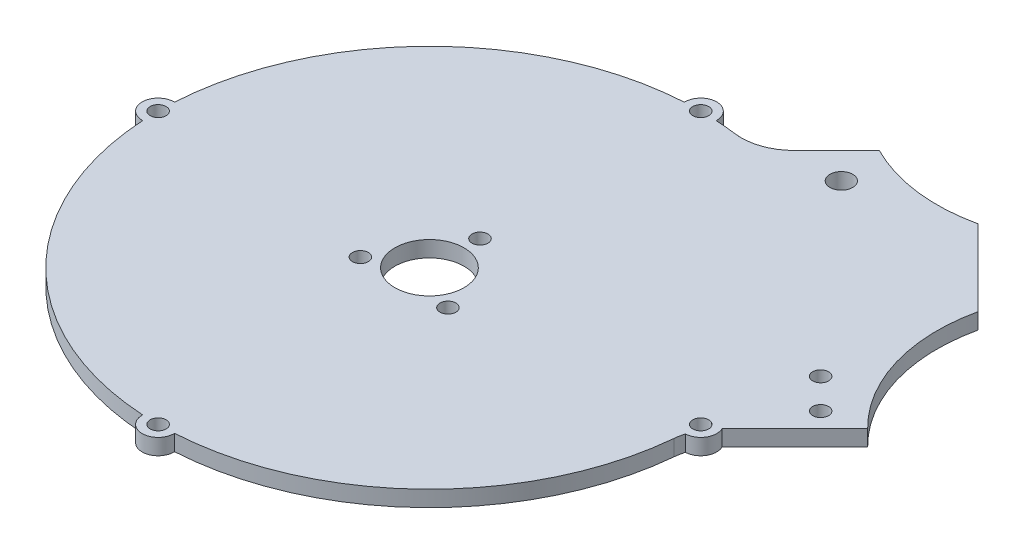
ISO-10303-21;
HEADER;
FILE_DESCRIPTION(('STEP AP214'),'2;1');
FILE_NAME('part.step','',(''),(''),'','','');
FILE_SCHEMA(('AUTOMOTIVE_DESIGN { 1 0 10303 214 1 1 1 1 }'));
ENDSEC;
DATA;
#1=APPLICATION_CONTEXT('core data for automotive mechanical design processes');
#2=APPLICATION_PROTOCOL_DEFINITION('international standard','automotive_design',2000,#1);
#3=PRODUCT_CONTEXT('',#1,'mechanical');
#4=PRODUCT('Part','Part','',(#3));
#5=PRODUCT_RELATED_PRODUCT_CATEGORY('part','',(#4));
#6=PRODUCT_DEFINITION_FORMATION('','',#4);
#7=PRODUCT_DEFINITION_CONTEXT('part definition',#1,'design');
#8=PRODUCT_DEFINITION('design','',#6,#7);
#9=PRODUCT_DEFINITION_SHAPE('','',#8);
#10=(LENGTH_UNIT() NAMED_UNIT(*) SI_UNIT(.MILLI.,.METRE.));
#11=(NAMED_UNIT(*) PLANE_ANGLE_UNIT() SI_UNIT($,.RADIAN.));
#12=(NAMED_UNIT(*) SI_UNIT($,.STERADIAN.) SOLID_ANGLE_UNIT());
#13=UNCERTAINTY_MEASURE_WITH_UNIT(LENGTH_MEASURE(1.E-05),#10,'distance_accuracy_value','');
#14=(GEOMETRIC_REPRESENTATION_CONTEXT(3) GLOBAL_UNCERTAINTY_ASSIGNED_CONTEXT((#13)) GLOBAL_UNIT_ASSIGNED_CONTEXT((#10,
#11,#12)) REPRESENTATION_CONTEXT('',''));
#15=CARTESIAN_POINT('',(0.,0.,0.));
#16=DIRECTION('',(0.,0.,1.));
#17=DIRECTION('',(1.,0.,0.));
#18=AXIS2_PLACEMENT_3D('',#15,#16,#17);
#19=CARTESIAN_POINT('',(0.,0.,0.));
#20=DIRECTION('',(0.,1.,0.));
#21=DIRECTION('',(0.,0.,1.));
#22=AXIS2_PLACEMENT_3D('',#19,#20,#21);
#23=CYLINDRICAL_SURFACE('',#22,51.);
#24=DIRECTION('',(0.,1.,0.));
#25=VECTOR('',#24,1.);
#26=CARTESIAN_POINT('',(2.99870214140638,1.5,50.9117647058823));
#27=LINE('',#26,#25);
#28=CARTESIAN_POINT('',(2.99870214140638,0.,50.9117647058823));
#29=VERTEX_POINT('',#28);
#30=CARTESIAN_POINT('',(2.99870214140638,3.,50.9117647058823));
#31=VERTEX_POINT('',#30);
#32=EDGE_CURVE('E147',#29,#31,#27,.T.);
#33=ORIENTED_EDGE('',*,*,#32,.F.);
#34=CARTESIAN_POINT('',(0.,0.,0.));
#35=DIRECTION('',(0.,1.,0.));
#36=DIRECTION('',(0.,0.,1.));
#37=AXIS2_PLACEMENT_3D('',#34,#35,#36);
#38=CIRCLE('',#37,51.);
#39=CARTESIAN_POINT('',(50.7738215927974,0.,4.79781625979776));
#40=VERTEX_POINT('',#39);
#41=EDGE_CURVE('E160',#29,#40,#38,.T.);
#42=ORIENTED_EDGE('',*,*,#41,.T.);
#43=DIRECTION('',(0.,1.,0.));
#44=VECTOR('',#43,1.);
#45=CARTESIAN_POINT('',(50.7738215927974,0.,4.79781625979776));
#46=LINE('',#45,#44);
#47=CARTESIAN_POINT('',(50.7738215927974,3.,4.79781625979776));
#48=VERTEX_POINT('',#47);
#49=EDGE_CURVE('E179',#40,#48,#46,.T.);
#50=ORIENTED_EDGE('',*,*,#49,.T.);
#51=CARTESIAN_POINT('',(0.,3.,0.));
#52=DIRECTION('',(0.,1.,0.));
#53=DIRECTION('',(0.,0.,1.));
#54=AXIS2_PLACEMENT_3D('',#51,#52,#53);
#55=CIRCLE('',#54,51.);
#56=EDGE_CURVE('E161',#31,#48,#55,.T.);
#57=ORIENTED_EDGE('',*,*,#56,.F.);
#58=EDGE_LOOP('',(#33,#42,#50,#57));
#59=FACE_BOUND('',#58,.T.);
#60=ADVANCED_FACE('F39',(#59),#23,.T.);
#61=DIRECTION('',(0.,1.,0.));
#62=VECTOR('',#61,1.);
#63=CARTESIAN_POINT('',(-2.99870214140531,1.5,50.9117647058824));
#64=LINE('',#63,#62);
#65=CARTESIAN_POINT('',(-2.99870214140531,3.,50.9117647058824));
#66=VERTEX_POINT('',#65);
#67=CARTESIAN_POINT('',(-2.99870214140531,0.,50.9117647058824));
#68=VERTEX_POINT('',#67);
#69=EDGE_CURVE('E150',#66,#68,#64,.F.);
#70=ORIENTED_EDGE('',*,*,#69,.F.);
#71=CARTESIAN_POINT('',(-50.9117647058824,3.,2.99870214140584));
#72=VERTEX_POINT('',#71);
#73=EDGE_CURVE('E479',#72,#66,#55,.T.);
#74=ORIENTED_EDGE('',*,*,#73,.F.);
#75=DIRECTION('',(0.,1.,0.));
#76=VECTOR('',#75,1.);
#77=CARTESIAN_POINT('',(-50.9117647058824,1.5,2.99870214140584));
#78=LINE('',#77,#76);
#79=CARTESIAN_POINT('',(-50.9117647058824,0.,2.99870214140584));
#80=VERTEX_POINT('',#79);
#81=EDGE_CURVE('E197',#80,#72,#78,.T.);
#82=ORIENTED_EDGE('',*,*,#81,.F.);
#83=EDGE_CURVE('E166',#80,#68,#38,.T.);
#84=ORIENTED_EDGE('',*,*,#83,.T.);
#85=EDGE_LOOP('',(#70,#74,#82,#84));
#86=FACE_BOUND('',#85,.T.);
#87=ADVANCED_FACE('F370',(#86),#23,.T.);
#88=DIRECTION('',(0.,1.,0.));
#89=VECTOR('',#88,1.);
#90=CARTESIAN_POINT('',(-50.9117647058824,1.5,-2.99870214140584));
#91=LINE('',#90,#89);
#92=CARTESIAN_POINT('',(-50.9117647058824,3.,-2.99870214140584));
#93=VERTEX_POINT('',#92);
#94=CARTESIAN_POINT('',(-50.9117647058824,0.,-2.99870214140584));
#95=VERTEX_POINT('',#94);
#96=EDGE_CURVE('E187',#93,#95,#91,.F.);
#97=ORIENTED_EDGE('',*,*,#96,.F.);
#98=CARTESIAN_POINT('',(-2.99870214140602,3.,-50.9117647058824));
#99=VERTEX_POINT('',#98);
#100=EDGE_CURVE('E291',#99,#93,#55,.T.);
#101=ORIENTED_EDGE('',*,*,#100,.F.);
#102=DIRECTION('',(0.,1.,0.));
#103=VECTOR('',#102,1.);
#104=CARTESIAN_POINT('',(-2.99870214140602,1.5,-50.9117647058824));
#105=LINE('',#104,#103);
#106=CARTESIAN_POINT('',(-2.99870214140602,0.,-50.9117647058824));
#107=VERTEX_POINT('',#106);
#108=EDGE_CURVE('E11',#107,#99,#105,.T.);
#109=ORIENTED_EDGE('',*,*,#108,.F.);
#110=EDGE_CURVE('E170',#107,#95,#38,.T.);
#111=ORIENTED_EDGE('',*,*,#110,.T.);
#112=EDGE_LOOP('',(#97,#101,#109,#111));
#113=FACE_BOUND('',#112,.T.);
#114=ADVANCED_FACE('F185',(#113),#23,.T.);
#115=CARTESIAN_POINT('',(60.7294728855028,0.,5.73856454603262));
#116=DIRECTION('',(0.,1.,0.));
#117=DIRECTION('',(0.,0.,1.));
#118=AXIS2_PLACEMENT_3D('',#115,#116,#117);
#119=CYLINDRICAL_SURFACE('',#118,10.);
#120=CARTESIAN_POINT('',(60.7294728855028,0.,5.73856454603262));
#121=DIRECTION('',(0.,1.,0.));
#122=DIRECTION('',(0.,0.,1.));
#123=AXIS2_PLACEMENT_3D('',#120,#121,#122);
#124=CIRCLE('',#123,10.);
#125=CARTESIAN_POINT('',(51.1123667835304,0.,2.99789487907082));
#126=VERTEX_POINT('',#125);
#127=EDGE_CURVE('E59',#126,#40,#124,.T.);
#128=ORIENTED_EDGE('',*,*,#127,.F.);
#129=DIRECTION('',(0.,1.,0.));
#130=VECTOR('',#129,1.);
#131=CARTESIAN_POINT('',(51.1123667835304,1.5,2.99789487907082));
#132=LINE('',#131,#130);
#133=CARTESIAN_POINT('',(51.1123667835304,3.,2.99789487907082));
#134=VERTEX_POINT('',#133);
#135=EDGE_CURVE('E54',#126,#134,#132,.T.);
#136=ORIENTED_EDGE('',*,*,#135,.T.);
#137=CARTESIAN_POINT('',(60.7294728855028,3.,5.73856454603262));
#138=DIRECTION('',(0.,1.,0.));
#139=DIRECTION('',(0.,0.,1.));
#140=AXIS2_PLACEMENT_3D('',#137,#138,#139);
#141=CIRCLE('',#140,10.);
#142=EDGE_CURVE('E231',#48,#134,#141,.F.);
#143=ORIENTED_EDGE('',*,*,#142,.F.);
#144=ORIENTED_EDGE('',*,*,#49,.F.);
#145=EDGE_LOOP('',(#128,#136,#143,#144));
#146=FACE_BOUND('',#145,.T.);
#147=ADVANCED_FACE('F387',(#146),#119,.F.);
#148=CARTESIAN_POINT('',(61.5182899632296,0.,-13.4350288425444));
#149=DIRECTION('',(0.,1.,0.));
#150=DIRECTION('',(0.,0.,1.));
#151=AXIS2_PLACEMENT_3D('',#148,#149,#150);
#152=PLANE('',#151);
#153=CARTESIAN_POINT('',(5.34196644842999E-13,0.,51.));
#154=DIRECTION('',(0.,1.,0.));
#155=DIRECTION('',(-1.,0.,0.));
#156=AXIS2_PLACEMENT_3D('',#153,#154,#155);
#157=CIRCLE('',#156,1.5);
#158=CARTESIAN_POINT('',(-1.49999999999947,0.,51.));
#159=VERTEX_POINT('',#158);
#160=EDGE_CURVE('E469',#159,#159,#157,.T.);
#161=ORIENTED_EDGE('',*,*,#160,.T.);
#162=EDGE_LOOP('',(#161));
#163=FACE_BOUND('',#162,.T.);
#164=ORIENTED_EDGE('',*,*,#41,.F.);
#165=CARTESIAN_POINT('',(5.34196644842999E-13,0.,51.));
#166=DIRECTION('',(0.,1.,0.));
#167=DIRECTION('',(-1.,0.,0.));
#168=AXIS2_PLACEMENT_3D('',#165,#166,#167);
#169=CIRCLE('',#168,3.);
#170=EDGE_CURVE('E144',#68,#29,#169,.T.);
#171=ORIENTED_EDGE('',*,*,#170,.F.);
#172=ORIENTED_EDGE('',*,*,#83,.F.);
#173=CARTESIAN_POINT('',(-51.,0.,0.));
#174=DIRECTION('',(0.,1.,0.));
#175=DIRECTION('',(0.,0.,-1.));
#176=AXIS2_PLACEMENT_3D('',#173,#174,#175);
#177=CIRCLE('',#176,3.);
#178=EDGE_CURVE('E192',#95,#80,#177,.T.);
#179=ORIENTED_EDGE('',*,*,#178,.F.);
#180=ORIENTED_EDGE('',*,*,#110,.F.);
#181=CARTESIAN_POINT('',(-1.78065548281E-13,0.,-51.));
#182=DIRECTION('',(0.,1.,0.));
#183=DIRECTION('',(1.,0.,0.));
#184=AXIS2_PLACEMENT_3D('',#181,#182,#183);
#185=CIRCLE('',#184,3.);
#186=CARTESIAN_POINT('',(2.99870214140566,0.,-50.9117647058824));
#187=VERTEX_POINT('',#186);
#188=EDGE_CURVE('E191',#187,#107,#185,.T.);
#189=ORIENTED_EDGE('',*,*,#188,.F.);
#190=CARTESIAN_POINT('',(6.79713410242907,0.,-50.5450192204296));
#191=VERTEX_POINT('',#190);
#192=EDGE_CURVE('E169',#191,#187,#38,.T.);
#193=ORIENTED_EDGE('',*,*,#192,.F.);
#194=CARTESIAN_POINT('',(8.12990549506221,0.,-60.4558073028668));
#195=DIRECTION('',(0.,1.,0.));
#196=DIRECTION('',(0.,0.,1.));
#197=AXIS2_PLACEMENT_3D('',#194,#195,#196);
#198=CIRCLE('',#197,10.);
#199=CARTESIAN_POINT('',(15.2009733069277,0.,-53.3847394910013));
#200=VERTEX_POINT('',#199);
#201=EDGE_CURVE('E172',#191,#200,#198,.T.);
#202=ORIENTED_EDGE('',*,*,#201,.T.);
#203=DIRECTION('',(-0.707106781186549,0.,0.707106781186546));
#204=VECTOR('',#203,1.);
#205=CARTESIAN_POINT('',(28.2842712474619,0.,-66.4680374315354));
#206=LINE('',#205,#204);
#207=CARTESIAN_POINT('',(23.1909186497913,0.,-61.3746848338648));
#208=VERTEX_POINT('',#207);
#209=EDGE_CURVE('E253',#208,#200,#206,.T.);
#210=ORIENTED_EDGE('',*,*,#209,.F.);
#211=CARTESIAN_POINT('',(37.4766594028945,0.,-89.4490078201218));
#212=DIRECTION('',(0.,1.,0.));
#213=DIRECTION('',(0.,0.,1.));
#214=AXIS2_PLACEMENT_3D('',#211,#212,#213);
#215=CIRCLE('',#214,31.5000000000246);
#216=CARTESIAN_POINT('',(44.4009767321595,0.,-58.7194808220505));
#217=VERTEX_POINT('',#216);
#218=EDGE_CURVE('E257',#208,#217,#215,.T.);
#219=ORIENTED_EDGE('',*,*,#218,.T.);
#220=DIRECTION('',(0.707106781186569,0.,0.707106781186526));
#221=VECTOR('',#220,1.);
#222=CARTESIAN_POINT('',(58.7194808220593,0.,-44.4009767321515));
#223=LINE('',#222,#221);
#224=CARTESIAN_POINT('',(58.7194808220593,0.,-44.4009767321515));
#225=VERTEX_POINT('',#224);
#226=EDGE_CURVE('E227',#217,#225,#223,.T.);
#227=ORIENTED_EDGE('',*,*,#226,.T.);
#228=CARTESIAN_POINT('',(89.4490078201045,0.,-37.4766594028825));
#229=DIRECTION('',(0.,1.,0.));
#230=DIRECTION('',(0.,0.,1.));
#231=AXIS2_PLACEMENT_3D('',#228,#229,#230);
#232=CIRCLE('',#231,31.5);
#233=CARTESIAN_POINT('',(67.3526224138888,0.,-15.0267206060844));
#234=VERTEX_POINT('',#233);
#235=EDGE_CURVE('E245',#225,#234,#232,.T.);
#236=ORIENTED_EDGE('',*,*,#235,.T.);
#237=DIRECTION('',(0.707106781186547,0.,-0.707106781186548));
#238=VECTOR('',#237,1.);
#239=CARTESIAN_POINT('',(63.6396103067892,0.,-11.3137084989848));
#240=LINE('',#239,#238);
#241=CARTESIAN_POINT('',(53.6780181730065,0.,-1.352116365202));
#242=VERTEX_POINT('',#241);
#243=EDGE_CURVE('E249',#242,#234,#240,.T.);
#244=ORIENTED_EDGE('',*,*,#243,.F.);
#245=CARTESIAN_POINT('',(51.,0.,0.));
#246=DIRECTION('',(0.,1.,0.));
#247=DIRECTION('',(0.,0.,1.));
#248=AXIS2_PLACEMENT_3D('',#245,#246,#247);
#249=CIRCLE('',#248,3.);
#250=EDGE_CURVE('E223',#126,#242,#249,.T.);
#251=ORIENTED_EDGE('',*,*,#250,.F.);
#252=ORIENTED_EDGE('',*,*,#127,.T.);
#253=EDGE_LOOP('',(#164,#171,#172,#179,#180,#189,#193,#202,#210,#219,#227,#236,#244,#251,#252));
#254=FACE_BOUND('',#253,.T.);
#255=CARTESIAN_POINT('',(0.,0.,0.));
#256=DIRECTION('',(0.,1.,0.));
#257=DIRECTION('',(0.,0.,1.));
#258=AXIS2_PLACEMENT_3D('',#255,#256,#257);
#259=CIRCLE('',#258,6.5);
#260=CARTESIAN_POINT('',(0.,0.,6.5));
#261=VERTEX_POINT('',#260);
#262=EDGE_CURVE('E240',#261,#261,#259,.T.);
#263=ORIENTED_EDGE('',*,*,#262,.T.);
#264=EDGE_LOOP('',(#263));
#265=FACE_BOUND('',#264,.T.);
#266=CARTESIAN_POINT('',(0.,0.,-9.5));
#267=DIRECTION('',(0.,1.,0.));
#268=DIRECTION('',(0.,0.,1.));
#269=AXIS2_PLACEMENT_3D('',#266,#267,#268);
#270=CIRCLE('',#269,1.5);
#271=CARTESIAN_POINT('',(0.,0.,-8.));
#272=VERTEX_POINT('',#271);
#273=EDGE_CURVE('E296',#272,#272,#270,.T.);
#274=ORIENTED_EDGE('',*,*,#273,.T.);
#275=EDGE_LOOP('',(#274));
#276=FACE_BOUND('',#275,.T.);
#277=CARTESIAN_POINT('',(8.22724133595277,0.,4.74999999999965));
#278=DIRECTION('',(0.,1.,0.));
#279=DIRECTION('',(0.,0.,1.));
#280=AXIS2_PLACEMENT_3D('',#277,#278,#279);
#281=CIRCLE('',#280,1.50000000000052);
#282=CARTESIAN_POINT('',(8.22724133595277,0.,6.25000000000017));
#283=VERTEX_POINT('',#282);
#284=EDGE_CURVE('E299',#283,#283,#281,.T.);
#285=ORIENTED_EDGE('',*,*,#284,.T.);
#286=EDGE_LOOP('',(#285));
#287=FACE_BOUND('',#286,.T.);
#288=CARTESIAN_POINT('',(-8.22724133595156,0.,4.75000000000035));
#289=DIRECTION('',(0.,1.,0.));
#290=DIRECTION('',(0.,0.,1.));
#291=AXIS2_PLACEMENT_3D('',#288,#289,#290);
#292=CIRCLE('',#291,1.50000000000077);
#293=CARTESIAN_POINT('',(-8.22724133595156,0.,6.25000000000112));
#294=VERTEX_POINT('',#293);
#295=EDGE_CURVE('E302',#294,#294,#292,.T.);
#296=ORIENTED_EDGE('',*,*,#295,.T.);
#297=EDGE_LOOP('',(#296));
#298=FACE_BOUND('',#297,.T.);
#299=CARTESIAN_POINT('',(54.4472221513641,0.,-19.0918830920368));
#300=DIRECTION('',(0.,1.,0.));
#301=DIRECTION('',(0.,0.,1.));
#302=AXIS2_PLACEMENT_3D('',#299,#300,#301);
#303=CIRCLE('',#302,1.50000000000001);
#304=CARTESIAN_POINT('',(54.4472221513641,0.,-17.5918830920368));
#305=VERTEX_POINT('',#304);
#306=EDGE_CURVE('E305',#305,#305,#303,.T.);
#307=ORIENTED_EDGE('',*,*,#306,.T.);
#308=EDGE_LOOP('',(#307));
#309=FACE_BOUND('',#308,.T.);
#310=CARTESIAN_POINT('',(60.1040764008567,0.,-13.4350288425445));
#311=DIRECTION('',(0.,1.,0.));
#312=DIRECTION('',(0.,0.,1.));
#313=AXIS2_PLACEMENT_3D('',#310,#311,#312);
#314=CIRCLE('',#313,1.5);
#315=CARTESIAN_POINT('',(60.1040764008567,0.,-11.9350288425446));
#316=VERTEX_POINT('',#315);
#317=EDGE_CURVE('E308',#316,#316,#314,.T.);
#318=ORIENTED_EDGE('',*,*,#317,.T.);
#319=EDGE_LOOP('',(#318));
#320=FACE_BOUND('',#319,.T.);
#321=CARTESIAN_POINT('',(24.5719606462309,0.,-52.8562318936951));
#322=DIRECTION('',(0.,1.,0.));
#323=DIRECTION('',(0.,0.,1.));
#324=AXIS2_PLACEMENT_3D('',#321,#322,#323);
#325=CIRCLE('',#324,2.15);
#326=CARTESIAN_POINT('',(24.5719606462309,0.,-50.7062318936951));
#327=VERTEX_POINT('',#326);
#328=EDGE_CURVE('E248',#327,#327,#325,.T.);
#329=ORIENTED_EDGE('',*,*,#328,.T.);
#330=EDGE_LOOP('',(#329));
#331=FACE_BOUND('',#330,.T.);
#332=CARTESIAN_POINT('',(-51.,0.,0.));
#333=DIRECTION('',(0.,1.,0.));
#334=DIRECTION('',(0.,0.,-1.));
#335=AXIS2_PLACEMENT_3D('',#332,#333,#334);
#336=CIRCLE('',#335,1.5);
#337=CARTESIAN_POINT('',(-51.,0.,-1.5));
#338=VERTEX_POINT('',#337);
#339=EDGE_CURVE('E200',#338,#338,#336,.T.);
#340=ORIENTED_EDGE('',*,*,#339,.T.);
#341=EDGE_LOOP('',(#340));
#342=FACE_BOUND('',#341,.T.);
#343=CARTESIAN_POINT('',(51.,0.,0.));
#344=DIRECTION('',(0.,1.,0.));
#345=DIRECTION('',(0.,0.,1.));
#346=AXIS2_PLACEMENT_3D('',#343,#344,#345);
#347=CIRCLE('',#346,1.5);
#348=CARTESIAN_POINT('',(51.,0.,1.5));
#349=VERTEX_POINT('',#348);
#350=EDGE_CURVE('E217',#349,#349,#347,.T.);
#351=ORIENTED_EDGE('',*,*,#350,.T.);
#352=EDGE_LOOP('',(#351));
#353=FACE_BOUND('',#352,.T.);
#354=CARTESIAN_POINT('',(-1.78065548281E-13,0.,-51.));
#355=DIRECTION('',(0.,1.,0.));
#356=DIRECTION('',(1.,0.,0.));
#357=AXIS2_PLACEMENT_3D('',#354,#355,#356);
#358=CIRCLE('',#357,1.5);
#359=CARTESIAN_POINT('',(1.49999999999983,0.,-51.));
#360=VERTEX_POINT('',#359);
#361=EDGE_CURVE('E207',#360,#360,#358,.T.);
#362=ORIENTED_EDGE('',*,*,#361,.T.);
#363=EDGE_LOOP('',(#362));
#364=FACE_BOUND('',#363,.T.);
#365=ADVANCED_FACE('F41',(#163,#254,#265,#276,#287,#298,#309,#320,#331,#342,#353,#364),#152,.F.);
#366=CARTESIAN_POINT('',(61.5182899632296,3.,-13.4350288425444));
#367=DIRECTION('',(0.,1.,0.));
#368=DIRECTION('',(0.,0.,1.));
#369=AXIS2_PLACEMENT_3D('',#366,#367,#368);
#370=PLANE('',#369);
#371=CARTESIAN_POINT('',(-1.78065548281E-13,3.,-51.));
#372=DIRECTION('',(0.,1.,0.));
#373=DIRECTION('',(1.,0.,0.));
#374=AXIS2_PLACEMENT_3D('',#371,#372,#373);
#375=CIRCLE('',#374,1.5);
#376=CARTESIAN_POINT('',(1.49999999999983,3.,-51.));
#377=VERTEX_POINT('',#376);
#378=EDGE_CURVE('E206',#377,#377,#375,.T.);
#379=ORIENTED_EDGE('',*,*,#378,.F.);
#380=EDGE_LOOP('',(#379));
#381=FACE_BOUND('',#380,.T.);
#382=CARTESIAN_POINT('',(-51.,3.,0.));
#383=DIRECTION('',(0.,1.,0.));
#384=DIRECTION('',(0.,0.,-1.));
#385=AXIS2_PLACEMENT_3D('',#382,#383,#384);
#386=CIRCLE('',#385,1.5);
#387=CARTESIAN_POINT('',(-51.,3.,-1.5));
#388=VERTEX_POINT('',#387);
#389=EDGE_CURVE('E162',#388,#388,#386,.T.);
#390=ORIENTED_EDGE('',*,*,#389,.F.);
#391=EDGE_LOOP('',(#390));
#392=FACE_BOUND('',#391,.T.);
#393=CARTESIAN_POINT('',(5.34196644842999E-13,3.,51.));
#394=DIRECTION('',(0.,1.,0.));
#395=DIRECTION('',(-1.,0.,0.));
#396=AXIS2_PLACEMENT_3D('',#393,#394,#395);
#397=CIRCLE('',#396,1.5);
#398=CARTESIAN_POINT('',(-1.49999999999947,3.,51.));
#399=VERTEX_POINT('',#398);
#400=EDGE_CURVE('E438',#399,#399,#397,.T.);
#401=ORIENTED_EDGE('',*,*,#400,.F.);
#402=EDGE_LOOP('',(#401));
#403=FACE_BOUND('',#402,.T.);
#404=CARTESIAN_POINT('',(51.,3.,0.));
#405=DIRECTION('',(0.,1.,0.));
#406=DIRECTION('',(0.,0.,1.));
#407=AXIS2_PLACEMENT_3D('',#404,#405,#406);
#408=CIRCLE('',#407,1.5);
#409=CARTESIAN_POINT('',(51.,3.,1.5));
#410=VERTEX_POINT('',#409);
#411=EDGE_CURVE('E214',#410,#410,#408,.T.);
#412=ORIENTED_EDGE('',*,*,#411,.F.);
#413=EDGE_LOOP('',(#412));
#414=FACE_BOUND('',#413,.T.);
#415=ORIENTED_EDGE('',*,*,#73,.T.);
#416=CARTESIAN_POINT('',(5.34196644842999E-13,3.,51.));
#417=DIRECTION('',(0.,1.,0.));
#418=DIRECTION('',(-1.,0.,0.));
#419=AXIS2_PLACEMENT_3D('',#416,#417,#418);
#420=CIRCLE('',#419,3.);
#421=EDGE_CURVE('E155',#66,#31,#420,.T.);
#422=ORIENTED_EDGE('',*,*,#421,.T.);
#423=ORIENTED_EDGE('',*,*,#56,.T.);
#424=ORIENTED_EDGE('',*,*,#142,.T.);
#425=CARTESIAN_POINT('',(51.,3.,0.));
#426=DIRECTION('',(0.,1.,0.));
#427=DIRECTION('',(0.,0.,1.));
#428=AXIS2_PLACEMENT_3D('',#425,#426,#427);
#429=CIRCLE('',#428,3.);
#430=CARTESIAN_POINT('',(53.6780181730065,3.,-1.352116365202));
#431=VERTEX_POINT('',#430);
#432=EDGE_CURVE('E220',#134,#431,#429,.T.);
#433=ORIENTED_EDGE('',*,*,#432,.T.);
#434=DIRECTION('',(0.707106781186547,0.,-0.707106781186548));
#435=VECTOR('',#434,1.);
#436=CARTESIAN_POINT('',(53.6584050736373,3.,-1.33250326583285));
#437=LINE('',#436,#435);
#438=CARTESIAN_POINT('',(67.3526224138888,3.,-15.0267206060844));
#439=VERTEX_POINT('',#438);
#440=EDGE_CURVE('E228',#431,#439,#437,.T.);
#441=ORIENTED_EDGE('',*,*,#440,.T.);
#442=CARTESIAN_POINT('',(89.4490078201045,3.,-37.4766594028825));
#443=DIRECTION('',(0.,1.,0.));
#444=DIRECTION('',(0.,0.,1.));
#445=AXIS2_PLACEMENT_3D('',#442,#443,#444);
#446=CIRCLE('',#445,31.5);
#447=CARTESIAN_POINT('',(58.7194808220593,3.,-44.4009767321515));
#448=VERTEX_POINT('',#447);
#449=EDGE_CURVE('E230',#439,#448,#446,.F.);
#450=ORIENTED_EDGE('',*,*,#449,.T.);
#451=DIRECTION('',(-0.707106781186569,0.,-0.707106781186526));
#452=VECTOR('',#451,1.);
#453=CARTESIAN_POINT('',(58.7194808220593,3.,-44.4009767321515));
#454=LINE('',#453,#452);
#455=CARTESIAN_POINT('',(44.4009767321595,3.,-58.7194808220505));
#456=VERTEX_POINT('',#455);
#457=EDGE_CURVE('E237',#448,#456,#454,.T.);
#458=ORIENTED_EDGE('',*,*,#457,.T.);
#459=CARTESIAN_POINT('',(37.4766594028945,3.,-89.4490078201218));
#460=DIRECTION('',(0.,1.,0.));
#461=DIRECTION('',(0.,0.,1.));
#462=AXIS2_PLACEMENT_3D('',#459,#460,#461);
#463=CIRCLE('',#462,31.5000000000246);
#464=CARTESIAN_POINT('',(23.1909186497913,3.,-61.3746848338648));
#465=VERTEX_POINT('',#464);
#466=EDGE_CURVE('E236',#456,#465,#463,.F.);
#467=ORIENTED_EDGE('',*,*,#466,.T.);
#468=DIRECTION('',(-0.707106781186548,0.,0.707106781186547));
#469=VECTOR('',#468,1.);
#470=CARTESIAN_POINT('',(23.1909186497913,3.,-61.3746848338648));
#471=LINE('',#470,#469);
#472=CARTESIAN_POINT('',(15.2009733069277,3.,-53.3847394910013));
#473=VERTEX_POINT('',#472);
#474=EDGE_CURVE('E232',#465,#473,#471,.T.);
#475=ORIENTED_EDGE('',*,*,#474,.T.);
#476=CARTESIAN_POINT('',(8.12990549506221,3.,-60.4558073028668));
#477=DIRECTION('',(0.,1.,0.));
#478=DIRECTION('',(0.,0.,1.));
#479=AXIS2_PLACEMENT_3D('',#476,#477,#478);
#480=CIRCLE('',#479,10.);
#481=CARTESIAN_POINT('',(6.79713410242907,3.,-50.5450192204296));
#482=VERTEX_POINT('',#481);
#483=EDGE_CURVE('E235',#473,#482,#480,.F.);
#484=ORIENTED_EDGE('',*,*,#483,.T.);
#485=CARTESIAN_POINT('',(2.99870214140566,3.,-50.9117647058824));
#486=VERTEX_POINT('',#485);
#487=EDGE_CURVE('E288',#482,#486,#55,.T.);
#488=ORIENTED_EDGE('',*,*,#487,.T.);
#489=CARTESIAN_POINT('',(-1.78065548281E-13,3.,-51.));
#490=DIRECTION('',(0.,1.,0.));
#491=DIRECTION('',(1.,0.,0.));
#492=AXIS2_PLACEMENT_3D('',#489,#490,#491);
#493=CIRCLE('',#492,3.);
#494=EDGE_CURVE('E210',#486,#99,#493,.T.);
#495=ORIENTED_EDGE('',*,*,#494,.T.);
#496=ORIENTED_EDGE('',*,*,#100,.T.);
#497=CARTESIAN_POINT('',(-51.,3.,0.));
#498=DIRECTION('',(0.,1.,0.));
#499=DIRECTION('',(0.,0.,-1.));
#500=AXIS2_PLACEMENT_3D('',#497,#498,#499);
#501=CIRCLE('',#500,3.);
#502=EDGE_CURVE('E195',#93,#72,#501,.T.);
#503=ORIENTED_EDGE('',*,*,#502,.T.);
#504=EDGE_LOOP('',(#415,#422,#423,#424,#433,#441,#450,#458,#467,#475,#484,#488,#495,#496,#503));
#505=FACE_BOUND('',#504,.T.);
#506=CARTESIAN_POINT('',(0.,3.,0.));
#507=DIRECTION('',(0.,1.,0.));
#508=DIRECTION('',(0.,0.,1.));
#509=AXIS2_PLACEMENT_3D('',#506,#507,#508);
#510=CIRCLE('',#509,6.5);
#511=CARTESIAN_POINT('',(0.,3.,6.5));
#512=VERTEX_POINT('',#511);
#513=EDGE_CURVE('E263',#512,#512,#510,.F.);
#514=ORIENTED_EDGE('',*,*,#513,.T.);
#515=EDGE_LOOP('',(#514));
#516=FACE_BOUND('',#515,.T.);
#517=CARTESIAN_POINT('',(0.,3.,-9.5));
#518=DIRECTION('',(0.,1.,0.));
#519=DIRECTION('',(0.,0.,1.));
#520=AXIS2_PLACEMENT_3D('',#517,#518,#519);
#521=CIRCLE('',#520,1.5);
#522=CARTESIAN_POINT('',(0.,3.,-8.));
#523=VERTEX_POINT('',#522);
#524=EDGE_CURVE('E267',#523,#523,#521,.F.);
#525=ORIENTED_EDGE('',*,*,#524,.T.);
#526=EDGE_LOOP('',(#525));
#527=FACE_BOUND('',#526,.T.);
#528=CARTESIAN_POINT('',(8.22724133595277,3.,4.74999999999965));
#529=DIRECTION('',(0.,1.,0.));
#530=DIRECTION('',(0.,0.,1.));
#531=AXIS2_PLACEMENT_3D('',#528,#529,#530);
#532=CIRCLE('',#531,1.50000000000052);
#533=CARTESIAN_POINT('',(8.22724133595277,3.,6.25000000000017));
#534=VERTEX_POINT('',#533);
#535=EDGE_CURVE('E270',#534,#534,#532,.F.);
#536=ORIENTED_EDGE('',*,*,#535,.T.);
#537=EDGE_LOOP('',(#536));
#538=FACE_BOUND('',#537,.T.);
#539=CARTESIAN_POINT('',(-8.22724133595156,3.,4.75000000000035));
#540=DIRECTION('',(0.,1.,0.));
#541=DIRECTION('',(0.,0.,1.));
#542=AXIS2_PLACEMENT_3D('',#539,#540,#541);
#543=CIRCLE('',#542,1.50000000000077);
#544=CARTESIAN_POINT('',(-8.22724133595156,3.,6.25000000000112));
#545=VERTEX_POINT('',#544);
#546=EDGE_CURVE('E273',#545,#545,#543,.F.);
#547=ORIENTED_EDGE('',*,*,#546,.T.);
#548=EDGE_LOOP('',(#547));
#549=FACE_BOUND('',#548,.T.);
#550=CARTESIAN_POINT('',(54.4472221513641,3.,-19.0918830920368));
#551=DIRECTION('',(0.,1.,0.));
#552=DIRECTION('',(0.,0.,1.));
#553=AXIS2_PLACEMENT_3D('',#550,#551,#552);
#554=CIRCLE('',#553,1.50000000000001);
#555=CARTESIAN_POINT('',(54.4472221513641,3.,-17.5918830920368));
#556=VERTEX_POINT('',#555);
#557=EDGE_CURVE('E276',#556,#556,#554,.F.);
#558=ORIENTED_EDGE('',*,*,#557,.T.);
#559=EDGE_LOOP('',(#558));
#560=FACE_BOUND('',#559,.T.);
#561=CARTESIAN_POINT('',(60.1040764008567,3.,-13.4350288425445));
#562=DIRECTION('',(0.,1.,0.));
#563=DIRECTION('',(0.,0.,1.));
#564=AXIS2_PLACEMENT_3D('',#561,#562,#563);
#565=CIRCLE('',#564,1.5);
#566=CARTESIAN_POINT('',(60.1040764008567,3.,-11.9350288425446));
#567=VERTEX_POINT('',#566);
#568=EDGE_CURVE('E279',#567,#567,#565,.F.);
#569=ORIENTED_EDGE('',*,*,#568,.T.);
#570=EDGE_LOOP('',(#569));
#571=FACE_BOUND('',#570,.T.);
#572=CARTESIAN_POINT('',(24.5719606462309,3.,-52.8562318936951));
#573=DIRECTION('',(0.,1.,0.));
#574=DIRECTION('',(0.,0.,1.));
#575=AXIS2_PLACEMENT_3D('',#572,#573,#574);
#576=CIRCLE('',#575,2.15);
#577=CARTESIAN_POINT('',(24.5719606462309,3.,-50.7062318936951));
#578=VERTEX_POINT('',#577);
#579=EDGE_CURVE('E282',#578,#578,#576,.F.);
#580=ORIENTED_EDGE('',*,*,#579,.T.);
#581=EDGE_LOOP('',(#580));
#582=FACE_BOUND('',#581,.T.);
#583=ADVANCED_FACE('F351',(#381,#392,#403,#414,#505,#516,#527,#538,#549,#560,#571,#582),#370,.T.);
#584=CARTESIAN_POINT('',(58.7194808220593,-7.,-44.4009767321515));
#585=DIRECTION('',(-0.707106781186526,0.,0.707106781186569));
#586=DIRECTION('',(0.707106781186569,0.,0.707106781186526));
#587=AXIS2_PLACEMENT_3D('',#584,#585,#586);
#588=PLANE('',#587);
#589=ORIENTED_EDGE('',*,*,#457,.F.);
#590=DIRECTION('',(0.,1.,0.));
#591=VECTOR('',#590,1.);
#592=CARTESIAN_POINT('',(58.7194808220593,0.,-44.4009767321515));
#593=LINE('',#592,#591);
#594=EDGE_CURVE('E244',#448,#225,#593,.F.);
#595=ORIENTED_EDGE('',*,*,#594,.T.);
#596=ORIENTED_EDGE('',*,*,#226,.F.);
#597=DIRECTION('',(0.,1.,0.));
#598=VECTOR('',#597,1.);
#599=CARTESIAN_POINT('',(44.4009767321595,0.,-58.7194808220505));
#600=LINE('',#599,#598);
#601=EDGE_CURVE('E258',#217,#456,#600,.T.);
#602=ORIENTED_EDGE('',*,*,#601,.T.);
#603=EDGE_LOOP('',(#589,#595,#596,#602));
#604=FACE_BOUND('',#603,.T.);
#605=ADVANCED_FACE('F348',(#604),#588,.F.);
#606=CARTESIAN_POINT('',(37.4766594028945,0.,-89.4490078201218));
#607=DIRECTION('',(0.,1.,0.));
#608=DIRECTION('',(0.,0.,1.));
#609=AXIS2_PLACEMENT_3D('',#606,#607,#608);
#610=CYLINDRICAL_SURFACE('',#609,31.5000000000246);
#611=ORIENTED_EDGE('',*,*,#218,.F.);
#612=DIRECTION('',(0.,1.,0.));
#613=VECTOR('',#612,1.);
#614=CARTESIAN_POINT('',(23.1909186497913,0.,-61.3746848338648));
#615=LINE('',#614,#613);
#616=EDGE_CURVE('E254',#465,#208,#615,.F.);
#617=ORIENTED_EDGE('',*,*,#616,.F.);
#618=ORIENTED_EDGE('',*,*,#466,.F.);
#619=ORIENTED_EDGE('',*,*,#601,.F.);
#620=EDGE_LOOP('',(#611,#617,#618,#619));
#621=FACE_BOUND('',#620,.T.);
#622=ADVANCED_FACE('F345',(#621),#610,.F.);
#623=CARTESIAN_POINT('',(28.2842712474619,0.,-66.4680374315354));
#624=DIRECTION('',(-0.707106781186546,0.,-0.707106781186549));
#625=DIRECTION('',(-0.707106781186549,0.,0.707106781186546));
#626=AXIS2_PLACEMENT_3D('',#623,#624,#625);
#627=PLANE('',#626);
#628=ORIENTED_EDGE('',*,*,#209,.T.);
#629=DIRECTION('',(0.,1.,0.));
#630=VECTOR('',#629,1.);
#631=CARTESIAN_POINT('',(15.2009733069277,0.,-53.3847394910013));
#632=LINE('',#631,#630);
#633=EDGE_CURVE('E251',#200,#473,#632,.T.);
#634=ORIENTED_EDGE('',*,*,#633,.T.);
#635=ORIENTED_EDGE('',*,*,#474,.F.);
#636=ORIENTED_EDGE('',*,*,#616,.T.);
#637=EDGE_LOOP('',(#628,#634,#635,#636));
#638=FACE_BOUND('',#637,.T.);
#639=ADVANCED_FACE('F341',(#638),#627,.T.);
#640=CARTESIAN_POINT('',(8.12990549506221,0.,-60.4558073028668));
#641=DIRECTION('',(0.,1.,0.));
#642=DIRECTION('',(0.,0.,1.));
#643=AXIS2_PLACEMENT_3D('',#640,#641,#642);
#644=CYLINDRICAL_SURFACE('',#643,10.);
#645=ORIENTED_EDGE('',*,*,#201,.F.);
#646=DIRECTION('',(0.,1.,0.));
#647=VECTOR('',#646,1.);
#648=CARTESIAN_POINT('',(6.79713410242907,0.,-50.5450192204296));
#649=LINE('',#648,#647);
#650=EDGE_CURVE('E167',#482,#191,#649,.F.);
#651=ORIENTED_EDGE('',*,*,#650,.F.);
#652=ORIENTED_EDGE('',*,*,#483,.F.);
#653=ORIENTED_EDGE('',*,*,#633,.F.);
#654=EDGE_LOOP('',(#645,#651,#652,#653));
#655=FACE_BOUND('',#654,.T.);
#656=ADVANCED_FACE('F338',(#655),#644,.F.);
#657=DIRECTION('',(0.,1.,0.));
#658=VECTOR('',#657,1.);
#659=CARTESIAN_POINT('',(2.99870214140566,1.5,-50.9117647058824));
#660=LINE('',#659,#658);
#661=EDGE_CURVE('E47',#486,#187,#660,.F.);
#662=ORIENTED_EDGE('',*,*,#661,.F.);
#663=ORIENTED_EDGE('',*,*,#487,.F.);
#664=ORIENTED_EDGE('',*,*,#650,.T.);
#665=ORIENTED_EDGE('',*,*,#192,.T.);
#666=EDGE_LOOP('',(#662,#663,#664,#665));
#667=FACE_BOUND('',#666,.T.);
#668=ADVANCED_FACE('F372',(#667),#23,.T.);
#669=CARTESIAN_POINT('',(63.6396103067892,0.,-11.3137084989848));
#670=DIRECTION('',(0.707106781186548,0.,0.707106781186547));
#671=DIRECTION('',(0.707106781186547,0.,-0.707106781186548));
#672=AXIS2_PLACEMENT_3D('',#669,#670,#671);
#673=PLANE('',#672);
#674=DIRECTION('',(0.,1.,0.));
#675=VECTOR('',#674,1.);
#676=CARTESIAN_POINT('',(53.6780181730065,0.,-1.352116365202));
#677=LINE('',#676,#675);
#678=EDGE_CURVE('E266',#242,#431,#677,.T.);
#679=ORIENTED_EDGE('',*,*,#678,.F.);
#680=ORIENTED_EDGE('',*,*,#243,.T.);
#681=DIRECTION('',(0.,1.,0.));
#682=VECTOR('',#681,1.);
#683=CARTESIAN_POINT('',(67.3526224138888,0.,-15.0267206060844));
#684=LINE('',#683,#682);
#685=EDGE_CURVE('E241',#234,#439,#684,.T.);
#686=ORIENTED_EDGE('',*,*,#685,.T.);
#687=ORIENTED_EDGE('',*,*,#440,.F.);
#688=EDGE_LOOP('',(#679,#680,#686,#687));
#689=FACE_BOUND('',#688,.T.);
#690=ADVANCED_FACE('F325',(#689),#673,.T.);
#691=CARTESIAN_POINT('',(89.4490078201045,0.,-37.4766594028825));
#692=DIRECTION('',(0.,1.,0.));
#693=DIRECTION('',(0.,0.,1.));
#694=AXIS2_PLACEMENT_3D('',#691,#692,#693);
#695=CYLINDRICAL_SURFACE('',#694,31.5);
#696=ORIENTED_EDGE('',*,*,#449,.F.);
#697=ORIENTED_EDGE('',*,*,#685,.F.);
#698=ORIENTED_EDGE('',*,*,#235,.F.);
#699=ORIENTED_EDGE('',*,*,#594,.F.);
#700=EDGE_LOOP('',(#696,#697,#698,#699));
#701=FACE_BOUND('',#700,.T.);
#702=ADVANCED_FACE('F321',(#701),#695,.F.);
#703=CARTESIAN_POINT('',(24.5719606462309,-47.,-52.8562318936951));
#704=DIRECTION('',(0.,1.,0.));
#705=DIRECTION('',(0.,0.,1.));
#706=AXIS2_PLACEMENT_3D('',#703,#704,#705);
#707=CYLINDRICAL_SURFACE('',#706,2.15);
#708=ORIENTED_EDGE('',*,*,#579,.F.);
#709=EDGE_LOOP('',(#708));
#710=FACE_BOUND('',#709,.T.);
#711=ORIENTED_EDGE('',*,*,#328,.F.);
#712=EDGE_LOOP('',(#711));
#713=FACE_BOUND('',#712,.T.);
#714=ADVANCED_FACE('F399',(#710,#713),#707,.F.);
#715=CARTESIAN_POINT('',(60.1040764008567,0.,-13.4350288425445));
#716=DIRECTION('',(0.,1.,0.));
#717=DIRECTION('',(0.,0.,1.));
#718=AXIS2_PLACEMENT_3D('',#715,#716,#717);
#719=CYLINDRICAL_SURFACE('',#718,1.5);
#720=ORIENTED_EDGE('',*,*,#568,.F.);
#721=EDGE_LOOP('',(#720));
#722=FACE_BOUND('',#721,.T.);
#723=ORIENTED_EDGE('',*,*,#317,.F.);
#724=EDGE_LOOP('',(#723));
#725=FACE_BOUND('',#724,.T.);
#726=ADVANCED_FACE('F402',(#722,#725),#719,.F.);
#727=CARTESIAN_POINT('',(54.4472221513641,0.,-19.0918830920368));
#728=DIRECTION('',(0.,1.,0.));
#729=DIRECTION('',(0.,0.,1.));
#730=AXIS2_PLACEMENT_3D('',#727,#728,#729);
#731=CYLINDRICAL_SURFACE('',#730,1.50000000000001);
#732=ORIENTED_EDGE('',*,*,#557,.F.);
#733=EDGE_LOOP('',(#732));
#734=FACE_BOUND('',#733,.T.);
#735=ORIENTED_EDGE('',*,*,#306,.F.);
#736=EDGE_LOOP('',(#735));
#737=FACE_BOUND('',#736,.T.);
#738=ADVANCED_FACE('F406',(#734,#737),#731,.F.);
#739=CARTESIAN_POINT('',(-8.22724133595156,-7.,4.75000000000035));
#740=DIRECTION('',(0.,1.,0.));
#741=DIRECTION('',(0.,0.,1.));
#742=AXIS2_PLACEMENT_3D('',#739,#740,#741);
#743=CYLINDRICAL_SURFACE('',#742,1.50000000000077);
#744=ORIENTED_EDGE('',*,*,#546,.F.);
#745=EDGE_LOOP('',(#744));
#746=FACE_BOUND('',#745,.T.);
#747=ORIENTED_EDGE('',*,*,#295,.F.);
#748=EDGE_LOOP('',(#747));
#749=FACE_BOUND('',#748,.T.);
#750=ADVANCED_FACE('F410',(#746,#749),#743,.F.);
#751=CARTESIAN_POINT('',(8.22724133595277,-7.,4.74999999999965));
#752=DIRECTION('',(0.,1.,0.));
#753=DIRECTION('',(0.,0.,1.));
#754=AXIS2_PLACEMENT_3D('',#751,#752,#753);
#755=CYLINDRICAL_SURFACE('',#754,1.50000000000052);
#756=ORIENTED_EDGE('',*,*,#535,.F.);
#757=EDGE_LOOP('',(#756));
#758=FACE_BOUND('',#757,.T.);
#759=ORIENTED_EDGE('',*,*,#284,.F.);
#760=EDGE_LOOP('',(#759));
#761=FACE_BOUND('',#760,.T.);
#762=ADVANCED_FACE('F414',(#758,#761),#755,.F.);
#763=CARTESIAN_POINT('',(0.,-7.,-9.5));
#764=DIRECTION('',(0.,1.,0.));
#765=DIRECTION('',(0.,0.,1.));
#766=AXIS2_PLACEMENT_3D('',#763,#764,#765);
#767=CYLINDRICAL_SURFACE('',#766,1.5);
#768=ORIENTED_EDGE('',*,*,#524,.F.);
#769=EDGE_LOOP('',(#768));
#770=FACE_BOUND('',#769,.T.);
#771=ORIENTED_EDGE('',*,*,#273,.F.);
#772=EDGE_LOOP('',(#771));
#773=FACE_BOUND('',#772,.T.);
#774=ADVANCED_FACE('F418',(#770,#773),#767,.F.);
#775=CARTESIAN_POINT('',(0.,0.,0.));
#776=DIRECTION('',(0.,1.,0.));
#777=DIRECTION('',(0.,0.,1.));
#778=AXIS2_PLACEMENT_3D('',#775,#776,#777);
#779=CYLINDRICAL_SURFACE('',#778,6.5);
#780=ORIENTED_EDGE('',*,*,#513,.F.);
#781=EDGE_LOOP('',(#780));
#782=FACE_BOUND('',#781,.T.);
#783=ORIENTED_EDGE('',*,*,#262,.F.);
#784=EDGE_LOOP('',(#783));
#785=FACE_BOUND('',#784,.T.);
#786=ADVANCED_FACE('F365',(#782,#785),#779,.F.);
#787=CARTESIAN_POINT('',(51.,0.,0.));
#788=DIRECTION('',(0.,1.,0.));
#789=DIRECTION('',(0.,0.,1.));
#790=AXIS2_PLACEMENT_3D('',#787,#788,#789);
#791=CYLINDRICAL_SURFACE('',#790,1.5);
#792=ORIENTED_EDGE('',*,*,#411,.T.);
#793=EDGE_LOOP('',(#792));
#794=FACE_BOUND('',#793,.T.);
#795=ORIENTED_EDGE('',*,*,#350,.F.);
#796=EDGE_LOOP('',(#795));
#797=FACE_BOUND('',#796,.T.);
#798=ADVANCED_FACE('F356',(#794,#797),#791,.F.);
#799=CARTESIAN_POINT('',(51.,0.,0.));
#800=DIRECTION('',(0.,1.,0.));
#801=DIRECTION('',(0.,0.,1.));
#802=AXIS2_PLACEMENT_3D('',#799,#800,#801);
#803=CYLINDRICAL_SURFACE('',#802,3.);
#804=ORIENTED_EDGE('',*,*,#135,.F.);
#805=ORIENTED_EDGE('',*,*,#250,.T.);
#806=ORIENTED_EDGE('',*,*,#678,.T.);
#807=ORIENTED_EDGE('',*,*,#432,.F.);
#808=EDGE_LOOP('',(#804,#805,#806,#807));
#809=FACE_BOUND('',#808,.T.);
#810=ADVANCED_FACE('F353',(#809),#803,.T.);
#811=CARTESIAN_POINT('',(-1.78065548281E-13,0.,-51.));
#812=DIRECTION('',(0.,1.,0.));
#813=DIRECTION('',(0.,0.,1.));
#814=AXIS2_PLACEMENT_3D('',#811,#812,#813);
#815=CYLINDRICAL_SURFACE('',#814,3.);
#816=ORIENTED_EDGE('',*,*,#188,.T.);
#817=ORIENTED_EDGE('',*,*,#108,.T.);
#818=ORIENTED_EDGE('',*,*,#494,.F.);
#819=ORIENTED_EDGE('',*,*,#661,.T.);
#820=EDGE_LOOP('',(#816,#817,#818,#819));
#821=FACE_BOUND('',#820,.T.);
#822=ADVANCED_FACE('F355',(#821),#815,.T.);
#823=CARTESIAN_POINT('',(-1.78065548281E-13,0.,-51.));
#824=DIRECTION('',(0.,1.,0.));
#825=DIRECTION('',(0.,0.,1.));
#826=AXIS2_PLACEMENT_3D('',#823,#824,#825);
#827=CYLINDRICAL_SURFACE('',#826,1.5);
#828=ORIENTED_EDGE('',*,*,#378,.T.);
#829=EDGE_LOOP('',(#828));
#830=FACE_BOUND('',#829,.T.);
#831=ORIENTED_EDGE('',*,*,#361,.F.);
#832=EDGE_LOOP('',(#831));
#833=FACE_BOUND('',#832,.T.);
#834=ADVANCED_FACE('F362',(#830,#833),#827,.F.);
#835=CARTESIAN_POINT('',(-51.,0.,0.));
#836=DIRECTION('',(0.,1.,0.));
#837=DIRECTION('',(0.,0.,1.));
#838=AXIS2_PLACEMENT_3D('',#835,#836,#837);
#839=CYLINDRICAL_SURFACE('',#838,3.);
#840=ORIENTED_EDGE('',*,*,#178,.T.);
#841=ORIENTED_EDGE('',*,*,#81,.T.);
#842=ORIENTED_EDGE('',*,*,#502,.F.);
#843=ORIENTED_EDGE('',*,*,#96,.T.);
#844=EDGE_LOOP('',(#840,#841,#842,#843));
#845=FACE_BOUND('',#844,.T.);
#846=ADVANCED_FACE('F447',(#845),#839,.T.);
#847=CARTESIAN_POINT('',(-51.,0.,0.));
#848=DIRECTION('',(0.,1.,0.));
#849=DIRECTION('',(0.,0.,1.));
#850=AXIS2_PLACEMENT_3D('',#847,#848,#849);
#851=CYLINDRICAL_SURFACE('',#850,1.5);
#852=ORIENTED_EDGE('',*,*,#389,.T.);
#853=EDGE_LOOP('',(#852));
#854=FACE_BOUND('',#853,.T.);
#855=ORIENTED_EDGE('',*,*,#339,.F.);
#856=EDGE_LOOP('',(#855));
#857=FACE_BOUND('',#856,.T.);
#858=ADVANCED_FACE('F453',(#854,#857),#851,.F.);
#859=CARTESIAN_POINT('',(5.34196644842999E-13,0.,51.));
#860=DIRECTION('',(0.,1.,0.));
#861=DIRECTION('',(0.,0.,1.));
#862=AXIS2_PLACEMENT_3D('',#859,#860,#861);
#863=CYLINDRICAL_SURFACE('',#862,3.);
#864=ORIENTED_EDGE('',*,*,#170,.T.);
#865=ORIENTED_EDGE('',*,*,#32,.T.);
#866=ORIENTED_EDGE('',*,*,#421,.F.);
#867=ORIENTED_EDGE('',*,*,#69,.T.);
#868=EDGE_LOOP('',(#864,#865,#866,#867));
#869=FACE_BOUND('',#868,.T.);
#870=ADVANCED_FACE('F146',(#869),#863,.T.);
#871=CARTESIAN_POINT('',(5.34196644842999E-13,0.,51.));
#872=DIRECTION('',(0.,1.,0.));
#873=DIRECTION('',(0.,0.,1.));
#874=AXIS2_PLACEMENT_3D('',#871,#872,#873);
#875=CYLINDRICAL_SURFACE('',#874,1.5);
#876=ORIENTED_EDGE('',*,*,#400,.T.);
#877=EDGE_LOOP('',(#876));
#878=FACE_BOUND('',#877,.T.);
#879=ORIENTED_EDGE('',*,*,#160,.F.);
#880=EDGE_LOOP('',(#879));
#881=FACE_BOUND('',#880,.T.);
#882=ADVANCED_FACE('F461',(#878,#881),#875,.F.);
#883=CLOSED_SHELL('',(#60,#87,#114,#147,#365,#583,#605,#622,#639,#656,#668,#690,#702,#714,#726,
#738,#750,#762,#774,#786,#798,#810,#822,#834,#846,#858,#870,#882));
#884=MANIFOLD_SOLID_BREP('B2',#883);
#885=ADVANCED_BREP_SHAPE_REPRESENTATION('',(#18,#884),#14);
#886=SHAPE_DEFINITION_REPRESENTATION(#9,#885);
ENDSEC;
END-ISO-10303-21;
